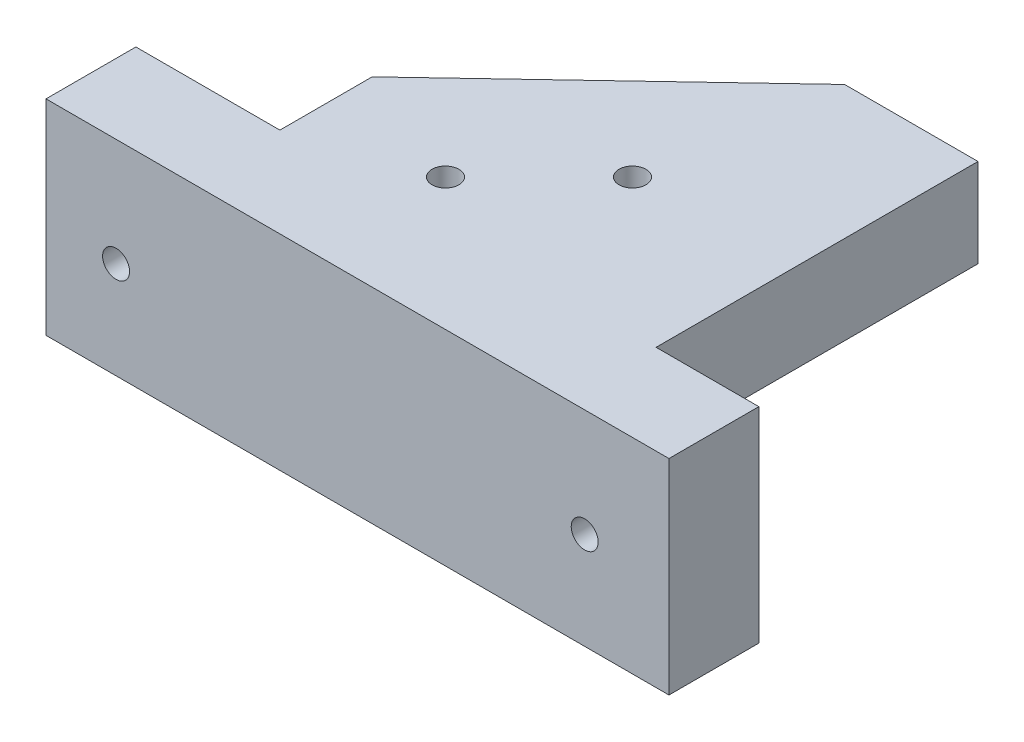
ISO-10303-21;
HEADER;
FILE_DESCRIPTION(('STEP AP214'),'2;1');
FILE_NAME('part.step','',(''),(''),'','','');
FILE_SCHEMA(('AUTOMOTIVE_DESIGN { 1 0 10303 214 1 1 1 1 }'));
ENDSEC;
DATA;
#1=APPLICATION_CONTEXT('core data for automotive mechanical design processes');
#2=APPLICATION_PROTOCOL_DEFINITION('international standard','automotive_design',2000,#1);
#3=PRODUCT_CONTEXT('',#1,'mechanical');
#4=PRODUCT('Part','Part','',(#3));
#5=PRODUCT_RELATED_PRODUCT_CATEGORY('part','',(#4));
#6=PRODUCT_DEFINITION_FORMATION('','',#4);
#7=PRODUCT_DEFINITION_CONTEXT('part definition',#1,'design');
#8=PRODUCT_DEFINITION('design','',#6,#7);
#9=PRODUCT_DEFINITION_SHAPE('','',#8);
#10=(LENGTH_UNIT() NAMED_UNIT(*) SI_UNIT(.MILLI.,.METRE.));
#11=(NAMED_UNIT(*) PLANE_ANGLE_UNIT() SI_UNIT($,.RADIAN.));
#12=(NAMED_UNIT(*) SI_UNIT($,.STERADIAN.) SOLID_ANGLE_UNIT());
#13=UNCERTAINTY_MEASURE_WITH_UNIT(LENGTH_MEASURE(1.E-05),#10,'distance_accuracy_value','');
#14=(GEOMETRIC_REPRESENTATION_CONTEXT(3) GLOBAL_UNCERTAINTY_ASSIGNED_CONTEXT((#13)) GLOBAL_UNIT_ASSIGNED_CONTEXT((#10,
#11,#12)) REPRESENTATION_CONTEXT('',''));
#15=CARTESIAN_POINT('',(0.,0.,0.));
#16=DIRECTION('',(0.,0.,1.));
#17=DIRECTION('',(1.,0.,0.));
#18=AXIS2_PLACEMENT_3D('',#15,#16,#17);
#19=CARTESIAN_POINT('',(-69.4767741901678,-14.6898747964315,15.));
#20=DIRECTION('',(1.,0.,0.));
#21=DIRECTION('',(0.,0.,-1.));
#22=AXIS2_PLACEMENT_3D('',#19,#20,#21);
#23=PLANE('',#22);
#24=DIRECTION('',(0.,0.,-1.));
#25=VECTOR('',#24,1.);
#26=CARTESIAN_POINT('',(-69.4767741901678,19.4961837580603,15.));
#27=LINE('',#26,#25);
#28=CARTESIAN_POINT('',(-69.4767741901678,19.4961837580603,15.));
#29=VERTEX_POINT('',#28);
#30=CARTESIAN_POINT('',(-69.4767741901678,19.4961837580603,0.));
#31=VERTEX_POINT('',#30);
#32=EDGE_CURVE('E115',#29,#31,#27,.T.);
#33=ORIENTED_EDGE('',*,*,#32,.T.);
#34=DIRECTION('',(0.,-1.,0.));
#35=VECTOR('',#34,1.);
#36=CARTESIAN_POINT('',(-69.4767741901678,-14.6898747964315,0.));
#37=LINE('',#36,#35);
#38=CARTESIAN_POINT('',(-69.4767741901678,-14.6898747964315,0.));
#39=VERTEX_POINT('',#38);
#40=EDGE_CURVE('E60',#31,#39,#37,.T.);
#41=ORIENTED_EDGE('',*,*,#40,.T.);
#42=DIRECTION('',(0.,0.,-1.));
#43=VECTOR('',#42,1.);
#44=CARTESIAN_POINT('',(-69.4767741901678,-14.6898747964315,15.));
#45=LINE('',#44,#43);
#46=CARTESIAN_POINT('',(-69.4767741901678,-14.6898747964315,15.));
#47=VERTEX_POINT('',#46);
#48=EDGE_CURVE('E11',#47,#39,#45,.T.);
#49=ORIENTED_EDGE('',*,*,#48,.F.);
#50=DIRECTION('',(0.,-1.,0.));
#51=VECTOR('',#50,1.);
#52=CARTESIAN_POINT('',(-69.4767741901678,-14.6898747964315,15.));
#53=LINE('',#52,#51);
#54=EDGE_CURVE('E102',#29,#47,#53,.T.);
#55=ORIENTED_EDGE('',*,*,#54,.F.);
#56=EDGE_LOOP('',(#33,#41,#49,#55));
#57=FACE_BOUND('',#56,.T.);
#58=ADVANCED_FACE('F32',(#57),#23,.F.);
#59=CARTESIAN_POINT('',(-69.4767741901678,-14.6898747964315,15.));
#60=DIRECTION('',(0.,1.,0.));
#61=DIRECTION('',(0.,0.,1.));
#62=AXIS2_PLACEMENT_3D('',#59,#60,#61);
#63=PLANE('',#62);
#64=DIRECTION('',(1.,0.,0.));
#65=VECTOR('',#64,1.);
#66=CARTESIAN_POINT('',(-69.4767741901678,-14.6898747964315,0.));
#67=LINE('',#66,#65);
#68=CARTESIAN_POINT('',(34.4916365637999,-14.6898747964315,0.));
#69=VERTEX_POINT('',#68);
#70=EDGE_CURVE('E107',#39,#69,#67,.T.);
#71=ORIENTED_EDGE('',*,*,#70,.T.);
#72=DIRECTION('',(0.,0.,-1.));
#73=VECTOR('',#72,1.);
#74=CARTESIAN_POINT('',(34.4916365637999,-14.6898747964315,15.));
#75=LINE('',#74,#73);
#76=CARTESIAN_POINT('',(34.4916365637999,-14.6898747964315,15.));
#77=VERTEX_POINT('',#76);
#78=EDGE_CURVE('E40',#77,#69,#75,.T.);
#79=ORIENTED_EDGE('',*,*,#78,.F.);
#80=DIRECTION('',(1.,0.,0.));
#81=VECTOR('',#80,1.);
#82=CARTESIAN_POINT('',(-69.4767741901678,-14.6898747964315,15.));
#83=LINE('',#82,#81);
#84=EDGE_CURVE('E95',#47,#77,#83,.T.);
#85=ORIENTED_EDGE('',*,*,#84,.F.);
#86=ORIENTED_EDGE('',*,*,#48,.T.);
#87=EDGE_LOOP('',(#71,#79,#85,#86));
#88=FACE_BOUND('',#87,.T.);
#89=ADVANCED_FACE('F106',(#88),#63,.F.);
#90=CARTESIAN_POINT('',(34.4916365637999,-14.6898747964315,15.));
#91=DIRECTION('',(-1.,0.,0.));
#92=DIRECTION('',(0.,0.,1.));
#93=AXIS2_PLACEMENT_3D('',#90,#91,#92);
#94=PLANE('',#93);
#95=DIRECTION('',(0.,1.,0.));
#96=VECTOR('',#95,1.);
#97=CARTESIAN_POINT('',(34.4916365637999,-14.6898747964315,0.));
#98=LINE('',#97,#96);
#99=CARTESIAN_POINT('',(34.4916365637999,19.4961837580603,0.));
#100=VERTEX_POINT('',#99);
#101=EDGE_CURVE('E122',#69,#100,#98,.T.);
#102=ORIENTED_EDGE('',*,*,#101,.T.);
#103=DIRECTION('',(0.,0.,-1.));
#104=VECTOR('',#103,1.);
#105=CARTESIAN_POINT('',(34.4916365637999,19.4961837580603,15.));
#106=LINE('',#105,#104);
#107=CARTESIAN_POINT('',(34.4916365637999,19.4961837580603,15.));
#108=VERTEX_POINT('',#107);
#109=EDGE_CURVE('E111',#108,#100,#106,.T.);
#110=ORIENTED_EDGE('',*,*,#109,.F.);
#111=DIRECTION('',(0.,1.,0.));
#112=VECTOR('',#111,1.);
#113=CARTESIAN_POINT('',(34.4916365637999,-14.6898747964315,15.));
#114=LINE('',#113,#112);
#115=EDGE_CURVE('E99',#77,#108,#114,.T.);
#116=ORIENTED_EDGE('',*,*,#115,.F.);
#117=ORIENTED_EDGE('',*,*,#78,.T.);
#118=EDGE_LOOP('',(#102,#110,#116,#117));
#119=FACE_BOUND('',#118,.T.);
#120=ADVANCED_FACE('F112',(#119),#94,.F.);
#121=CARTESIAN_POINT('',(-69.4767741901678,19.4961837580603,15.));
#122=DIRECTION('',(0.,-1.,0.));
#123=DIRECTION('',(0.,0.,-1.));
#124=AXIS2_PLACEMENT_3D('',#121,#122,#123);
#125=PLANE('',#124);
#126=CARTESIAN_POINT('',(-9.23707809743127,19.4961837580603,-22.6408211142234));
#127=DIRECTION('',(0.,-1.,0.));
#128=DIRECTION('',(0.,0.,-1.));
#129=AXIS2_PLACEMENT_3D('',#126,#127,#128);
#130=CIRCLE('',#129,2.25);
#131=CARTESIAN_POINT('',(-9.23707809743127,19.4961837580603,-24.8908211142234));
#132=VERTEX_POINT('',#131);
#133=EDGE_CURVE('E263',#132,#132,#130,.T.);
#134=ORIENTED_EDGE('',*,*,#133,.T.);
#135=EDGE_LOOP('',(#134));
#136=FACE_BOUND('',#135,.T.);
#137=CARTESIAN_POINT('',(-24.8420709117046,19.4961837580603,-7.0358282999498));
#138=DIRECTION('',(0.,-1.,0.));
#139=DIRECTION('',(0.,0.,-1.));
#140=AXIS2_PLACEMENT_3D('',#137,#138,#139);
#141=CIRCLE('',#140,2.25);
#142=CARTESIAN_POINT('',(-24.8420709117046,19.4961837580603,-9.2858282999498));
#143=VERTEX_POINT('',#142);
#144=EDGE_CURVE('E174',#143,#143,#141,.T.);
#145=ORIENTED_EDGE('',*,*,#144,.T.);
#146=EDGE_LOOP('',(#145));
#147=FACE_BOUND('',#146,.T.);
#148=DIRECTION('',(0.,0.,1.));
#149=VECTOR('',#148,1.);
#150=CARTESIAN_POINT('',(-45.4412560306554,19.4961837580603,0.));
#151=LINE('',#150,#149);
#152=CARTESIAN_POINT('',(-45.4412560306555,19.4961837580603,-15.4000000000002));
#153=VERTEX_POINT('',#152);
#154=CARTESIAN_POINT('',(-45.4412560306554,19.4961837580603,0.));
#155=VERTEX_POINT('',#154);
#156=EDGE_CURVE('E161',#153,#155,#151,.T.);
#157=ORIENTED_EDGE('',*,*,#156,.T.);
#158=DIRECTION('',(-1.,0.,0.));
#159=VECTOR('',#158,1.);
#160=CARTESIAN_POINT('',(-69.4767741901678,19.4961837580603,0.));
#161=LINE('',#160,#159);
#162=EDGE_CURVE('E180',#155,#31,#161,.T.);
#163=ORIENTED_EDGE('',*,*,#162,.T.);
#164=ORIENTED_EDGE('',*,*,#32,.F.);
#165=DIRECTION('',(-1.,0.,0.));
#166=VECTOR('',#165,1.);
#167=CARTESIAN_POINT('',(-69.4767741901678,19.4961837580603,15.));
#168=LINE('',#167,#166);
#169=EDGE_CURVE('E48',#108,#29,#168,.T.);
#170=ORIENTED_EDGE('',*,*,#169,.F.);
#171=ORIENTED_EDGE('',*,*,#109,.T.);
#172=DIRECTION('',(-1.,0.,0.));
#173=VECTOR('',#172,1.);
#174=CARTESIAN_POINT('',(34.4916365637999,19.4961837580603,0.));
#175=LINE('',#174,#173);
#176=CARTESIAN_POINT('',(17.344905680126,19.4961837580603,0.));
#177=VERTEX_POINT('',#176);
#178=EDGE_CURVE('E133',#100,#177,#175,.T.);
#179=ORIENTED_EDGE('',*,*,#178,.T.);
#180=DIRECTION('',(0.,0.,-1.));
#181=VECTOR('',#180,1.);
#182=CARTESIAN_POINT('',(17.344905680126,19.4961837580603,0.));
#183=LINE('',#182,#181);
#184=CARTESIAN_POINT('',(17.344905680126,19.4961837580603,-53.7223840854919));
#185=VERTEX_POINT('',#184);
#186=EDGE_CURVE('E164',#177,#185,#183,.T.);
#187=ORIENTED_EDGE('',*,*,#186,.T.);
#188=DIRECTION('',(-1.,0.,0.));
#189=VECTOR('',#188,1.);
#190=CARTESIAN_POINT('',(17.344905680126,19.4961837580603,-53.7223840854919));
#191=LINE('',#190,#189);
#192=CARTESIAN_POINT('',(-4.90916325395509,19.4961837580603,-53.7223840854919));
#193=VERTEX_POINT('',#192);
#194=EDGE_CURVE('E149',#185,#193,#191,.T.);
#195=ORIENTED_EDGE('',*,*,#194,.T.);
#196=DIRECTION('',(-0.726636516838525,0.,0.68702210473665));
#197=VECTOR('',#196,1.);
#198=CARTESIAN_POINT('',(-45.4412560306555,19.4961837580603,-15.4000000000002));
#199=LINE('',#198,#197);
#200=EDGE_CURVE('E159',#193,#153,#199,.T.);
#201=ORIENTED_EDGE('',*,*,#200,.T.);
#202=EDGE_LOOP('',(#157,#163,#164,#170,#171,#179,#187,#195,#201));
#203=FACE_BOUND('',#202,.T.);
#204=ADVANCED_FACE('F129',(#136,#147,#203),#125,.F.);
#205=CARTESIAN_POINT('',(0.,0.,15.));
#206=DIRECTION('',(0.,0.,-1.));
#207=DIRECTION('',(-1.,0.,0.));
#208=AXIS2_PLACEMENT_3D('',#205,#206,#207);
#209=PLANE('',#208);
#210=CARTESIAN_POINT('',(-57.7823194312308,1.49846116090471,15.));
#211=DIRECTION('',(0.,0.,-1.));
#212=DIRECTION('',(-1.,0.,0.));
#213=AXIS2_PLACEMENT_3D('',#210,#211,#212);
#214=CIRCLE('',#213,2.25);
#215=CARTESIAN_POINT('',(-60.0323194312308,1.49846116090471,15.));
#216=VERTEX_POINT('',#215);
#217=EDGE_CURVE('E247',#216,#216,#214,.T.);
#218=ORIENTED_EDGE('',*,*,#217,.T.);
#219=EDGE_LOOP('',(#218));
#220=FACE_BOUND('',#219,.T.);
#221=CARTESIAN_POINT('',(20.4264892959067,1.49846116090477,15.));
#222=DIRECTION('',(0.,0.,-1.));
#223=DIRECTION('',(-1.,0.,0.));
#224=AXIS2_PLACEMENT_3D('',#221,#222,#223);
#225=CIRCLE('',#224,2.25);
#226=CARTESIAN_POINT('',(18.1764892959067,1.49846116090477,15.));
#227=VERTEX_POINT('',#226);
#228=EDGE_CURVE('E257',#227,#227,#225,.T.);
#229=ORIENTED_EDGE('',*,*,#228,.T.);
#230=EDGE_LOOP('',(#229));
#231=FACE_BOUND('',#230,.T.);
#232=ORIENTED_EDGE('',*,*,#54,.T.);
#233=ORIENTED_EDGE('',*,*,#84,.T.);
#234=ORIENTED_EDGE('',*,*,#115,.T.);
#235=ORIENTED_EDGE('',*,*,#169,.T.);
#236=EDGE_LOOP('',(#232,#233,#234,#235));
#237=FACE_BOUND('',#236,.T.);
#238=ADVANCED_FACE('F97',(#220,#231,#237),#209,.F.);
#239=CARTESIAN_POINT('',(0.,0.,0.));
#240=DIRECTION('',(0.,0.,-1.));
#241=DIRECTION('',(-1.,0.,0.));
#242=AXIS2_PLACEMENT_3D('',#239,#240,#241);
#243=PLANE('',#242);
#244=CARTESIAN_POINT('',(-57.7823194312308,1.49846116090471,0.));
#245=DIRECTION('',(0.,0.,-1.));
#246=DIRECTION('',(-1.,0.,0.));
#247=AXIS2_PLACEMENT_3D('',#244,#245,#246);
#248=CIRCLE('',#247,2.24999999999999);
#249=CARTESIAN_POINT('',(-60.0323194312308,1.49846116090471,0.));
#250=VERTEX_POINT('',#249);
#251=EDGE_CURVE('E250',#250,#250,#248,.T.);
#252=ORIENTED_EDGE('',*,*,#251,.F.);
#253=EDGE_LOOP('',(#252));
#254=FACE_BOUND('',#253,.T.);
#255=CARTESIAN_POINT('',(20.4264892959067,1.49846116090477,0.));
#256=DIRECTION('',(0.,0.,-1.));
#257=DIRECTION('',(-1.,0.,0.));
#258=AXIS2_PLACEMENT_3D('',#255,#256,#257);
#259=CIRCLE('',#258,2.24999999999999);
#260=CARTESIAN_POINT('',(18.1764892959067,1.49846116090477,0.));
#261=VERTEX_POINT('',#260);
#262=EDGE_CURVE('E252',#261,#261,#259,.T.);
#263=ORIENTED_EDGE('',*,*,#262,.F.);
#264=EDGE_LOOP('',(#263));
#265=FACE_BOUND('',#264,.T.);
#266=DIRECTION('',(-1.,0.,0.));
#267=VECTOR('',#266,1.);
#268=CARTESIAN_POINT('',(-69.4767741901678,4.70927359222628,0.));
#269=LINE('',#268,#267);
#270=CARTESIAN_POINT('',(17.344905680126,4.70927359222627,0.));
#271=VERTEX_POINT('',#270);
#272=CARTESIAN_POINT('',(-45.4412560306554,4.70927359222627,0.));
#273=VERTEX_POINT('',#272);
#274=EDGE_CURVE('E120',#271,#273,#269,.T.);
#275=ORIENTED_EDGE('',*,*,#274,.F.);
#276=DIRECTION('',(0.,-1.,0.));
#277=VECTOR('',#276,1.);
#278=CARTESIAN_POINT('',(17.344905680126,19.4961837580603,0.));
#279=LINE('',#278,#277);
#280=EDGE_CURVE('E170',#177,#271,#279,.T.);
#281=ORIENTED_EDGE('',*,*,#280,.F.);
#282=ORIENTED_EDGE('',*,*,#178,.F.);
#283=ORIENTED_EDGE('',*,*,#101,.F.);
#284=ORIENTED_EDGE('',*,*,#70,.F.);
#285=ORIENTED_EDGE('',*,*,#40,.F.);
#286=ORIENTED_EDGE('',*,*,#162,.F.);
#287=DIRECTION('',(0.,-1.,0.));
#288=VECTOR('',#287,1.);
#289=CARTESIAN_POINT('',(-45.4412560306554,19.4961837580603,0.));
#290=LINE('',#289,#288);
#291=EDGE_CURVE('E71',#155,#273,#290,.T.);
#292=ORIENTED_EDGE('',*,*,#291,.T.);
#293=EDGE_LOOP('',(#275,#281,#282,#283,#284,#285,#286,#292));
#294=FACE_BOUND('',#293,.T.);
#295=ADVANCED_FACE('F192',(#254,#265,#294),#243,.T.);
#296=CARTESIAN_POINT('',(-69.4767741901678,4.70927359222628,-60.));
#297=DIRECTION('',(0.,1.,0.));
#298=DIRECTION('',(-1.,0.,0.));
#299=AXIS2_PLACEMENT_3D('',#296,#297,#298);
#300=PLANE('',#299);
#301=CARTESIAN_POINT('',(-9.23707809743127,4.70927359222628,-22.6408211142234));
#302=DIRECTION('',(0.,-1.,0.));
#303=DIRECTION('',(0.,0.,-1.));
#304=AXIS2_PLACEMENT_3D('',#301,#302,#303);
#305=CIRCLE('',#304,2.25);
#306=CARTESIAN_POINT('',(-9.23707809743127,4.70927359222628,-24.8908211142234));
#307=VERTEX_POINT('',#306);
#308=EDGE_CURVE('E260',#307,#307,#305,.T.);
#309=ORIENTED_EDGE('',*,*,#308,.F.);
#310=EDGE_LOOP('',(#309));
#311=FACE_BOUND('',#310,.T.);
#312=CARTESIAN_POINT('',(-24.8420709117046,4.70927359222628,-7.0358282999498));
#313=DIRECTION('',(0.,-1.,0.));
#314=DIRECTION('',(0.,0.,-1.));
#315=AXIS2_PLACEMENT_3D('',#312,#313,#314);
#316=CIRCLE('',#315,2.25);
#317=CARTESIAN_POINT('',(-24.8420709117046,4.70927359222628,-9.2858282999498));
#318=VERTEX_POINT('',#317);
#319=EDGE_CURVE('E266',#318,#318,#316,.T.);
#320=ORIENTED_EDGE('',*,*,#319,.F.);
#321=EDGE_LOOP('',(#320));
#322=FACE_BOUND('',#321,.T.);
#323=ORIENTED_EDGE('',*,*,#274,.T.);
#324=DIRECTION('',(0.,0.,1.));
#325=VECTOR('',#324,1.);
#326=CARTESIAN_POINT('',(-45.4412560306554,4.70927359222627,0.));
#327=LINE('',#326,#325);
#328=CARTESIAN_POINT('',(-45.4412560306555,4.70927359222627,-15.4000000000002));
#329=VERTEX_POINT('',#328);
#330=EDGE_CURVE('E178',#329,#273,#327,.T.);
#331=ORIENTED_EDGE('',*,*,#330,.F.);
#332=DIRECTION('',(-0.726636516838525,0.,0.68702210473665));
#333=VECTOR('',#332,1.);
#334=CARTESIAN_POINT('',(-45.4412560306555,4.70927359222627,-15.4000000000002));
#335=LINE('',#334,#333);
#336=CARTESIAN_POINT('',(-4.90916325395509,4.70927359222627,-53.7223840854919));
#337=VERTEX_POINT('',#336);
#338=EDGE_CURVE('E176',#337,#329,#335,.T.);
#339=ORIENTED_EDGE('',*,*,#338,.F.);
#340=DIRECTION('',(-1.,0.,0.));
#341=VECTOR('',#340,1.);
#342=CARTESIAN_POINT('',(17.344905680126,4.70927359222627,-53.7223840854919));
#343=LINE('',#342,#341);
#344=CARTESIAN_POINT('',(17.344905680126,4.70927359222627,-53.7223840854919));
#345=VERTEX_POINT('',#344);
#346=EDGE_CURVE('E151',#345,#337,#343,.T.);
#347=ORIENTED_EDGE('',*,*,#346,.F.);
#348=DIRECTION('',(0.,0.,-1.));
#349=VECTOR('',#348,1.);
#350=CARTESIAN_POINT('',(17.344905680126,4.70927359222627,0.));
#351=LINE('',#350,#349);
#352=EDGE_CURVE('E171',#271,#345,#351,.T.);
#353=ORIENTED_EDGE('',*,*,#352,.F.);
#354=EDGE_LOOP('',(#323,#331,#339,#347,#353));
#355=FACE_BOUND('',#354,.T.);
#356=ADVANCED_FACE('F190',(#311,#322,#355),#300,.F.);
#357=CARTESIAN_POINT('',(-45.4412560306554,19.4961837580603,0.));
#358=DIRECTION('',(1.,0.,0.));
#359=DIRECTION('',(0.,0.,-1.));
#360=AXIS2_PLACEMENT_3D('',#357,#358,#359);
#361=PLANE('',#360);
#362=ORIENTED_EDGE('',*,*,#330,.T.);
#363=ORIENTED_EDGE('',*,*,#291,.F.);
#364=ORIENTED_EDGE('',*,*,#156,.F.);
#365=DIRECTION('',(0.,-1.,0.));
#366=VECTOR('',#365,1.);
#367=CARTESIAN_POINT('',(-45.4412560306555,19.4961837580603,-15.4000000000002));
#368=LINE('',#367,#366);
#369=EDGE_CURVE('E155',#153,#329,#368,.T.);
#370=ORIENTED_EDGE('',*,*,#369,.T.);
#371=EDGE_LOOP('',(#362,#363,#364,#370));
#372=FACE_BOUND('',#371,.T.);
#373=ADVANCED_FACE('F194',(#372),#361,.F.);
#374=CARTESIAN_POINT('',(-45.4412560306555,19.4961837580603,-15.4000000000002));
#375=DIRECTION('',(0.68702210473665,0.,0.726636516838525));
#376=DIRECTION('',(0.726636516838525,0.,-0.68702210473665));
#377=AXIS2_PLACEMENT_3D('',#374,#375,#376);
#378=PLANE('',#377);
#379=ORIENTED_EDGE('',*,*,#338,.T.);
#380=ORIENTED_EDGE('',*,*,#369,.F.);
#381=ORIENTED_EDGE('',*,*,#200,.F.);
#382=DIRECTION('',(0.,-1.,0.));
#383=VECTOR('',#382,1.);
#384=CARTESIAN_POINT('',(-4.90916325395509,19.4961837580603,-53.7223840854919));
#385=LINE('',#384,#383);
#386=EDGE_CURVE('E145',#193,#337,#385,.T.);
#387=ORIENTED_EDGE('',*,*,#386,.T.);
#388=EDGE_LOOP('',(#379,#380,#381,#387));
#389=FACE_BOUND('',#388,.T.);
#390=ADVANCED_FACE('F160',(#389),#378,.F.);
#391=CARTESIAN_POINT('',(17.344905680126,19.4961837580603,-53.7223840854919));
#392=DIRECTION('',(0.,0.,1.));
#393=DIRECTION('',(1.,0.,0.));
#394=AXIS2_PLACEMENT_3D('',#391,#392,#393);
#395=PLANE('',#394);
#396=ORIENTED_EDGE('',*,*,#346,.T.);
#397=ORIENTED_EDGE('',*,*,#386,.F.);
#398=ORIENTED_EDGE('',*,*,#194,.F.);
#399=DIRECTION('',(0.,-1.,0.));
#400=VECTOR('',#399,1.);
#401=CARTESIAN_POINT('',(17.344905680126,19.4961837580603,-53.7223840854919));
#402=LINE('',#401,#400);
#403=EDGE_CURVE('E156',#185,#345,#402,.T.);
#404=ORIENTED_EDGE('',*,*,#403,.T.);
#405=EDGE_LOOP('',(#396,#397,#398,#404));
#406=FACE_BOUND('',#405,.T.);
#407=ADVANCED_FACE('F147',(#406),#395,.F.);
#408=CARTESIAN_POINT('',(17.344905680126,19.4961837580603,0.));
#409=DIRECTION('',(-1.,0.,0.));
#410=DIRECTION('',(0.,0.,1.));
#411=AXIS2_PLACEMENT_3D('',#408,#409,#410);
#412=PLANE('',#411);
#413=ORIENTED_EDGE('',*,*,#352,.T.);
#414=ORIENTED_EDGE('',*,*,#403,.F.);
#415=ORIENTED_EDGE('',*,*,#186,.F.);
#416=ORIENTED_EDGE('',*,*,#280,.T.);
#417=EDGE_LOOP('',(#413,#414,#415,#416));
#418=FACE_BOUND('',#417,.T.);
#419=ADVANCED_FACE('F217',(#418),#412,.F.);
#420=CARTESIAN_POINT('',(-24.8420709117046,4.70927359222628,-7.0358282999498));
#421=DIRECTION('',(0.,-1.,0.));
#422=DIRECTION('',(0.,0.,-1.));
#423=AXIS2_PLACEMENT_3D('',#420,#421,#422);
#424=CYLINDRICAL_SURFACE('',#423,2.25);
#425=ORIENTED_EDGE('',*,*,#144,.F.);
#426=EDGE_LOOP('',(#425));
#427=FACE_BOUND('',#426,.T.);
#428=ORIENTED_EDGE('',*,*,#319,.T.);
#429=EDGE_LOOP('',(#428));
#430=FACE_BOUND('',#429,.T.);
#431=ADVANCED_FACE('F220',(#427,#430),#424,.F.);
#432=CARTESIAN_POINT('',(-9.23707809743127,4.70927359222628,-22.6408211142234));
#433=DIRECTION('',(0.,-1.,0.));
#434=DIRECTION('',(0.,0.,-1.));
#435=AXIS2_PLACEMENT_3D('',#432,#433,#434);
#436=CYLINDRICAL_SURFACE('',#435,2.25);
#437=ORIENTED_EDGE('',*,*,#133,.F.);
#438=EDGE_LOOP('',(#437));
#439=FACE_BOUND('',#438,.T.);
#440=ORIENTED_EDGE('',*,*,#308,.T.);
#441=EDGE_LOOP('',(#440));
#442=FACE_BOUND('',#441,.T.);
#443=ADVANCED_FACE('F230',(#439,#442),#436,.F.);
#444=CARTESIAN_POINT('',(20.4264892959067,1.49846116090477,0.));
#445=DIRECTION('',(0.,0.,-1.));
#446=DIRECTION('',(-1.,0.,0.));
#447=AXIS2_PLACEMENT_3D('',#444,#445,#446);
#448=CYLINDRICAL_SURFACE('',#447,2.24999999999999);
#449=ORIENTED_EDGE('',*,*,#228,.F.);
#450=EDGE_LOOP('',(#449));
#451=FACE_BOUND('',#450,.T.);
#452=ORIENTED_EDGE('',*,*,#262,.T.);
#453=EDGE_LOOP('',(#452));
#454=FACE_BOUND('',#453,.T.);
#455=ADVANCED_FACE('F234',(#451,#454),#448,.F.);
#456=CARTESIAN_POINT('',(-57.7823194312308,1.49846116090471,0.));
#457=DIRECTION('',(0.,0.,-1.));
#458=DIRECTION('',(-1.,0.,0.));
#459=AXIS2_PLACEMENT_3D('',#456,#457,#458);
#460=CYLINDRICAL_SURFACE('',#459,2.24999999999999);
#461=ORIENTED_EDGE('',*,*,#217,.F.);
#462=EDGE_LOOP('',(#461));
#463=FACE_BOUND('',#462,.T.);
#464=ORIENTED_EDGE('',*,*,#251,.T.);
#465=EDGE_LOOP('',(#464));
#466=FACE_BOUND('',#465,.T.);
#467=ADVANCED_FACE('F238',(#463,#466),#460,.F.);
#468=CLOSED_SHELL('',(#58,#89,#120,#204,#238,#295,#356,#373,#390,#407,#419,#431,#443,#455,#467));
#469=MANIFOLD_SOLID_BREP('B2',#468);
#470=ADVANCED_BREP_SHAPE_REPRESENTATION('',(#18,#469),#14);
#471=SHAPE_DEFINITION_REPRESENTATION(#9,#470);
ENDSEC;
END-ISO-10303-21;
